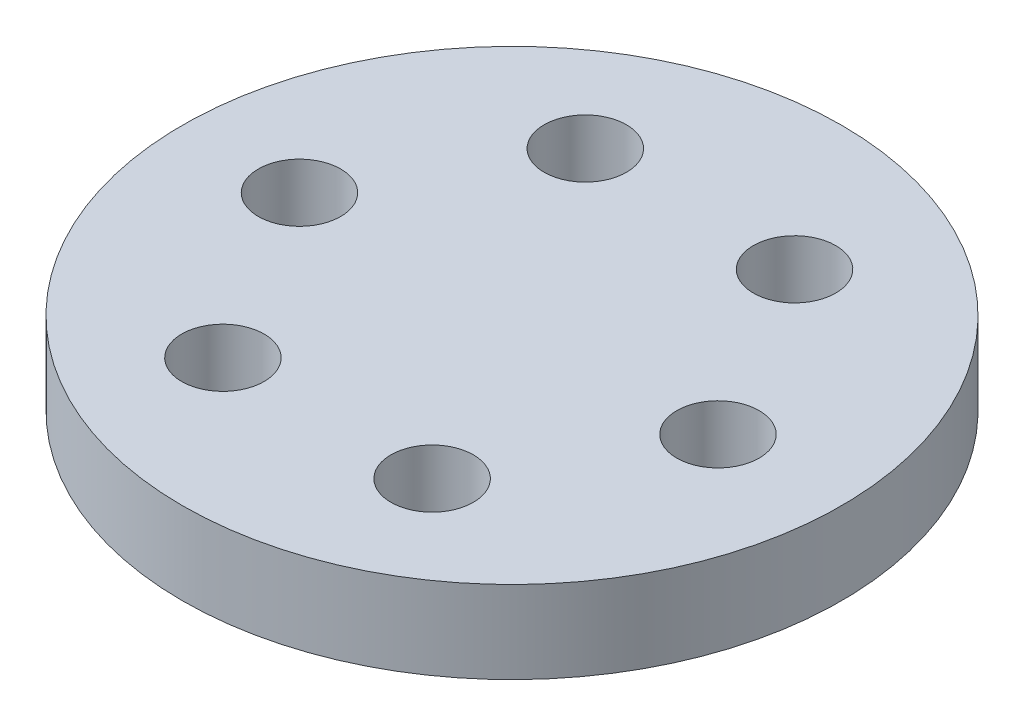
ISO-10303-21;
HEADER;
FILE_DESCRIPTION(('STEP AP214'),'2;1');
FILE_NAME('part.step','',(''),(''),'','','');
FILE_SCHEMA(('AUTOMOTIVE_DESIGN { 1 0 10303 214 1 1 1 1 }'));
ENDSEC;
DATA;
#1=APPLICATION_CONTEXT('core data for automotive mechanical design processes');
#2=APPLICATION_PROTOCOL_DEFINITION('international standard','automotive_design',2000,#1);
#3=PRODUCT_CONTEXT('',#1,'mechanical');
#4=PRODUCT('Part','Part','',(#3));
#5=PRODUCT_RELATED_PRODUCT_CATEGORY('part','',(#4));
#6=PRODUCT_DEFINITION_FORMATION('','',#4);
#7=PRODUCT_DEFINITION_CONTEXT('part definition',#1,'design');
#8=PRODUCT_DEFINITION('design','',#6,#7);
#9=PRODUCT_DEFINITION_SHAPE('','',#8);
#10=(LENGTH_UNIT() NAMED_UNIT(*) SI_UNIT(.MILLI.,.METRE.));
#11=(NAMED_UNIT(*) PLANE_ANGLE_UNIT() SI_UNIT($,.RADIAN.));
#12=(NAMED_UNIT(*) SI_UNIT($,.STERADIAN.) SOLID_ANGLE_UNIT());
#13=UNCERTAINTY_MEASURE_WITH_UNIT(LENGTH_MEASURE(1.E-05),#10,'distance_accuracy_value','');
#14=(GEOMETRIC_REPRESENTATION_CONTEXT(3) GLOBAL_UNCERTAINTY_ASSIGNED_CONTEXT((#13)) GLOBAL_UNIT_ASSIGNED_CONTEXT((#10,
#11,#12)) REPRESENTATION_CONTEXT('',''));
#15=CARTESIAN_POINT('',(0.,0.,0.));
#16=DIRECTION('',(0.,0.,1.));
#17=DIRECTION('',(1.,0.,0.));
#18=AXIS2_PLACEMENT_3D('',#15,#16,#17);
#19=CARTESIAN_POINT('',(0.,10.,0.));
#20=DIRECTION('',(0.,-1.,0.));
#21=DIRECTION('',(0.,0.,-1.));
#22=AXIS2_PLACEMENT_3D('',#19,#20,#21);
#23=CYLINDRICAL_SURFACE('',#22,40.);
#24=CARTESIAN_POINT('',(0.,10.,0.));
#25=DIRECTION('',(0.,1.,0.));
#26=DIRECTION('',(0.,0.,1.));
#27=AXIS2_PLACEMENT_3D('',#24,#25,#26);
#28=CIRCLE('',#27,40.);
#29=CARTESIAN_POINT('',(0.,10.,40.));
#30=VERTEX_POINT('',#29);
#31=EDGE_CURVE('E10',#30,#30,#28,.T.);
#32=ORIENTED_EDGE('',*,*,#31,.F.);
#33=EDGE_LOOP('',(#32));
#34=FACE_BOUND('',#33,.T.);
#35=CARTESIAN_POINT('',(0.,0.,0.));
#36=DIRECTION('',(0.,1.,0.));
#37=DIRECTION('',(0.,0.,1.));
#38=AXIS2_PLACEMENT_3D('',#35,#36,#37);
#39=CIRCLE('',#38,40.);
#40=CARTESIAN_POINT('',(0.,0.,40.));
#41=VERTEX_POINT('',#40);
#42=EDGE_CURVE('E42',#41,#41,#39,.T.);
#43=ORIENTED_EDGE('',*,*,#42,.T.);
#44=EDGE_LOOP('',(#43));
#45=FACE_BOUND('',#44,.T.);
#46=ADVANCED_FACE('F39',(#34,#45),#23,.T.);
#47=CARTESIAN_POINT('',(0.,10.,0.));
#48=DIRECTION('',(0.,1.,0.));
#49=DIRECTION('',(0.,0.,1.));
#50=AXIS2_PLACEMENT_3D('',#47,#48,#49);
#51=PLANE('',#50);
#52=CARTESIAN_POINT('',(12.3015873019615,10.,-21.9942959689126));
#53=DIRECTION('',(0.,1.,0.));
#54=DIRECTION('',(0.866025403775933,0.,0.500000000014732));
#55=AXIS2_PLACEMENT_3D('',#52,#53,#54);
#56=CIRCLE('',#55,5.);
#57=CARTESIAN_POINT('',(16.6317143208411,10.,-19.4942959688389));
#58=VERTEX_POINT('',#57);
#59=EDGE_CURVE('E63',#58,#58,#56,.T.);
#60=ORIENTED_EDGE('',*,*,#59,.F.);
#61=EDGE_LOOP('',(#60));
#62=FACE_BOUND('',#61,.T.);
#63=CARTESIAN_POINT('',(-13.0952380949388,10.,-21.9942959693014));
#64=DIRECTION('',(0.,1.,0.));
#65=DIRECTION('',(0.866025403791243,0.,-0.499999999988214));
#66=AXIS2_PLACEMENT_3D('',#63,#64,#65);
#67=CIRCLE('',#66,5.);
#68=CARTESIAN_POINT('',(-8.76511107598255,10.,-24.4942959692425));
#69=VERTEX_POINT('',#68);
#70=EDGE_CURVE('E69',#69,#69,#67,.T.);
#71=ORIENTED_EDGE('',*,*,#70,.F.);
#72=EDGE_LOOP('',(#71));
#73=FACE_BOUND('',#72,.T.);
#74=CARTESIAN_POINT('',(-25.7936507936508,10.,-2.59232394825998E-10));
#75=DIRECTION('',(0.,1.,0.));
#76=DIRECTION('',(1.02068239345139E-11,0.,-1.));
#77=AXIS2_PLACEMENT_3D('',#74,#75,#76);
#78=CIRCLE('',#77,5.);
#79=CARTESIAN_POINT('',(-25.7936507935998,10.,-5.00000000025923));
#80=VERTEX_POINT('',#79);
#81=EDGE_CURVE('E75',#80,#80,#78,.T.);
#82=ORIENTED_EDGE('',*,*,#81,.F.);
#83=EDGE_LOOP('',(#82));
#84=FACE_BOUND('',#83,.T.);
#85=CARTESIAN_POINT('',(-13.0952380953878,10.,21.9942959690422));
#86=DIRECTION('',(0.,1.,0.));
#87=DIRECTION('',(-0.866025403781036,0.,-0.500000000005893));
#88=AXIS2_PLACEMENT_3D('',#85,#86,#87);
#89=CIRCLE('',#88,5.);
#90=CARTESIAN_POINT('',(-17.4253651142929,10.,19.4942959690127));
#91=VERTEX_POINT('',#90);
#92=EDGE_CURVE('E81',#91,#91,#89,.T.);
#93=ORIENTED_EDGE('',*,*,#92,.F.);
#94=EDGE_LOOP('',(#93));
#95=FACE_BOUND('',#94,.T.);
#96=CARTESIAN_POINT('',(12.3015873015125,10.,21.9942959691718));
#97=DIRECTION('',(0.,1.,0.));
#98=DIRECTION('',(-0.86602540378614,0.,0.499999999997054));
#99=AXIS2_PLACEMENT_3D('',#96,#97,#98);
#100=CIRCLE('',#99,5.);
#101=CARTESIAN_POINT('',(7.97146028258177,10.,24.4942959691571));
#102=VERTEX_POINT('',#101);
#103=EDGE_CURVE('E57',#102,#102,#100,.T.);
#104=ORIENTED_EDGE('',*,*,#103,.F.);
#105=EDGE_LOOP('',(#104));
#106=FACE_BOUND('',#105,.T.);
#107=CARTESIAN_POINT('',(25.,10.,0.));
#108=DIRECTION('',(0.,1.,0.));
#109=DIRECTION('',(0.,0.,1.));
#110=AXIS2_PLACEMENT_3D('',#107,#108,#109);
#111=CIRCLE('',#110,5.);
#112=CARTESIAN_POINT('',(25.,10.,5.));
#113=VERTEX_POINT('',#112);
#114=EDGE_CURVE('E51',#113,#113,#111,.T.);
#115=ORIENTED_EDGE('',*,*,#114,.F.);
#116=EDGE_LOOP('',(#115));
#117=FACE_BOUND('',#116,.T.);
#118=ORIENTED_EDGE('',*,*,#31,.T.);
#119=EDGE_LOOP('',(#118));
#120=FACE_BOUND('',#119,.T.);
#121=ADVANCED_FACE('F98',(#62,#73,#84,#95,#106,#117,#120),#51,.T.);
#122=CARTESIAN_POINT('',(0.,0.,0.));
#123=DIRECTION('',(0.,1.,0.));
#124=DIRECTION('',(0.,0.,1.));
#125=AXIS2_PLACEMENT_3D('',#122,#123,#124);
#126=PLANE('',#125);
#127=CARTESIAN_POINT('',(12.3015873019615,0.,-21.9942959689126));
#128=DIRECTION('',(0.,1.,0.));
#129=DIRECTION('',(0.866025403775933,0.,0.500000000014732));
#130=AXIS2_PLACEMENT_3D('',#127,#128,#129);
#131=CIRCLE('',#130,5.);
#132=CARTESIAN_POINT('',(16.6317143208411,0.,-19.4942959688389));
#133=VERTEX_POINT('',#132);
#134=EDGE_CURVE('E66',#133,#133,#131,.T.);
#135=ORIENTED_EDGE('',*,*,#134,.T.);
#136=EDGE_LOOP('',(#135));
#137=FACE_BOUND('',#136,.T.);
#138=CARTESIAN_POINT('',(-13.0952380949388,0.,-21.9942959693014));
#139=DIRECTION('',(0.,1.,0.));
#140=DIRECTION('',(0.866025403791243,0.,-0.499999999988214));
#141=AXIS2_PLACEMENT_3D('',#138,#139,#140);
#142=CIRCLE('',#141,5.);
#143=CARTESIAN_POINT('',(-8.76511107598255,0.,-24.4942959692425));
#144=VERTEX_POINT('',#143);
#145=EDGE_CURVE('E72',#144,#144,#142,.T.);
#146=ORIENTED_EDGE('',*,*,#145,.T.);
#147=EDGE_LOOP('',(#146));
#148=FACE_BOUND('',#147,.T.);
#149=CARTESIAN_POINT('',(-25.7936507936508,0.,-2.59232394825998E-10));
#150=DIRECTION('',(0.,1.,0.));
#151=DIRECTION('',(1.02068239345139E-11,0.,-1.));
#152=AXIS2_PLACEMENT_3D('',#149,#150,#151);
#153=CIRCLE('',#152,5.);
#154=CARTESIAN_POINT('',(-25.7936507935998,0.,-5.00000000025923));
#155=VERTEX_POINT('',#154);
#156=EDGE_CURVE('E78',#155,#155,#153,.T.);
#157=ORIENTED_EDGE('',*,*,#156,.T.);
#158=EDGE_LOOP('',(#157));
#159=FACE_BOUND('',#158,.T.);
#160=CARTESIAN_POINT('',(-13.0952380953878,0.,21.9942959690422));
#161=DIRECTION('',(0.,1.,0.));
#162=DIRECTION('',(-0.866025403781036,0.,-0.500000000005893));
#163=AXIS2_PLACEMENT_3D('',#160,#161,#162);
#164=CIRCLE('',#163,5.);
#165=CARTESIAN_POINT('',(-17.4253651142929,0.,19.4942959690127));
#166=VERTEX_POINT('',#165);
#167=EDGE_CURVE('E60',#166,#166,#164,.T.);
#168=ORIENTED_EDGE('',*,*,#167,.T.);
#169=EDGE_LOOP('',(#168));
#170=FACE_BOUND('',#169,.T.);
#171=CARTESIAN_POINT('',(12.3015873015125,0.,21.9942959691718));
#172=DIRECTION('',(0.,1.,0.));
#173=DIRECTION('',(-0.86602540378614,0.,0.499999999997054));
#174=AXIS2_PLACEMENT_3D('',#171,#172,#173);
#175=CIRCLE('',#174,5.);
#176=CARTESIAN_POINT('',(7.97146028258177,0.,24.4942959691571));
#177=VERTEX_POINT('',#176);
#178=EDGE_CURVE('E54',#177,#177,#175,.T.);
#179=ORIENTED_EDGE('',*,*,#178,.T.);
#180=EDGE_LOOP('',(#179));
#181=FACE_BOUND('',#180,.T.);
#182=CARTESIAN_POINT('',(25.,0.,0.));
#183=DIRECTION('',(0.,1.,0.));
#184=DIRECTION('',(0.,0.,1.));
#185=AXIS2_PLACEMENT_3D('',#182,#183,#184);
#186=CIRCLE('',#185,5.);
#187=CARTESIAN_POINT('',(25.,0.,5.));
#188=VERTEX_POINT('',#187);
#189=EDGE_CURVE('E49',#188,#188,#186,.T.);
#190=ORIENTED_EDGE('',*,*,#189,.T.);
#191=EDGE_LOOP('',(#190));
#192=FACE_BOUND('',#191,.T.);
#193=ORIENTED_EDGE('',*,*,#42,.F.);
#194=EDGE_LOOP('',(#193));
#195=FACE_BOUND('',#194,.T.);
#196=ADVANCED_FACE('F87',(#137,#148,#159,#170,#181,#192,#195),#126,.F.);
#197=CARTESIAN_POINT('',(25.,0.,0.));
#198=DIRECTION('',(0.,1.,0.));
#199=DIRECTION('',(0.,0.,1.));
#200=AXIS2_PLACEMENT_3D('',#197,#198,#199);
#201=CYLINDRICAL_SURFACE('',#200,5.);
#202=ORIENTED_EDGE('',*,*,#189,.F.);
#203=EDGE_LOOP('',(#202));
#204=FACE_BOUND('',#203,.T.);
#205=ORIENTED_EDGE('',*,*,#114,.T.);
#206=EDGE_LOOP('',(#205));
#207=FACE_BOUND('',#206,.T.);
#208=ADVANCED_FACE('F107',(#204,#207),#201,.F.);
#209=CARTESIAN_POINT('',(12.3015873015125,0.,21.9942959691718));
#210=DIRECTION('',(0.,1.,0.));
#211=DIRECTION('',(0.,0.,1.));
#212=AXIS2_PLACEMENT_3D('',#209,#210,#211);
#213=CYLINDRICAL_SURFACE('',#212,5.);
#214=ORIENTED_EDGE('',*,*,#178,.F.);
#215=EDGE_LOOP('',(#214));
#216=FACE_BOUND('',#215,.T.);
#217=ORIENTED_EDGE('',*,*,#103,.T.);
#218=EDGE_LOOP('',(#217));
#219=FACE_BOUND('',#218,.T.);
#220=ADVANCED_FACE('F94',(#216,#219),#213,.F.);
#221=CARTESIAN_POINT('',(-13.0952380953878,0.,21.9942959690422));
#222=DIRECTION('',(0.,1.,0.));
#223=DIRECTION('',(0.,0.,1.));
#224=AXIS2_PLACEMENT_3D('',#221,#222,#223);
#225=CYLINDRICAL_SURFACE('',#224,5.);
#226=ORIENTED_EDGE('',*,*,#167,.F.);
#227=EDGE_LOOP('',(#226));
#228=FACE_BOUND('',#227,.T.);
#229=ORIENTED_EDGE('',*,*,#92,.T.);
#230=EDGE_LOOP('',(#229));
#231=FACE_BOUND('',#230,.T.);
#232=ADVANCED_FACE('F90',(#228,#231),#225,.F.);
#233=CARTESIAN_POINT('',(-25.7936507936508,0.,-2.59232394825998E-10));
#234=DIRECTION('',(0.,1.,0.));
#235=DIRECTION('',(0.,0.,1.));
#236=AXIS2_PLACEMENT_3D('',#233,#234,#235);
#237=CYLINDRICAL_SURFACE('',#236,5.);
#238=ORIENTED_EDGE('',*,*,#156,.F.);
#239=EDGE_LOOP('',(#238));
#240=FACE_BOUND('',#239,.T.);
#241=ORIENTED_EDGE('',*,*,#81,.T.);
#242=EDGE_LOOP('',(#241));
#243=FACE_BOUND('',#242,.T.);
#244=ADVANCED_FACE('F93',(#240,#243),#237,.F.);
#245=CARTESIAN_POINT('',(-13.0952380949388,0.,-21.9942959693014));
#246=DIRECTION('',(0.,1.,0.));
#247=DIRECTION('',(0.,0.,1.));
#248=AXIS2_PLACEMENT_3D('',#245,#246,#247);
#249=CYLINDRICAL_SURFACE('',#248,5.);
#250=ORIENTED_EDGE('',*,*,#145,.F.);
#251=EDGE_LOOP('',(#250));
#252=FACE_BOUND('',#251,.T.);
#253=ORIENTED_EDGE('',*,*,#70,.T.);
#254=EDGE_LOOP('',(#253));
#255=FACE_BOUND('',#254,.T.);
#256=ADVANCED_FACE('F164',(#252,#255),#249,.F.);
#257=CARTESIAN_POINT('',(12.3015873019615,0.,-21.9942959689126));
#258=DIRECTION('',(0.,1.,0.));
#259=DIRECTION('',(0.,0.,1.));
#260=AXIS2_PLACEMENT_3D('',#257,#258,#259);
#261=CYLINDRICAL_SURFACE('',#260,5.);
#262=ORIENTED_EDGE('',*,*,#134,.F.);
#263=EDGE_LOOP('',(#262));
#264=FACE_BOUND('',#263,.T.);
#265=ORIENTED_EDGE('',*,*,#59,.T.);
#266=EDGE_LOOP('',(#265));
#267=FACE_BOUND('',#266,.T.);
#268=ADVANCED_FACE('F174',(#264,#267),#261,.F.);
#269=CLOSED_SHELL('',(#46,#121,#196,#208,#220,#232,#244,#256,#268));
#270=MANIFOLD_SOLID_BREP('B2',#269);
#271=ADVANCED_BREP_SHAPE_REPRESENTATION('',(#18,#270),#14);
#272=SHAPE_DEFINITION_REPRESENTATION(#9,#271);
ENDSEC;
END-ISO-10303-21;
